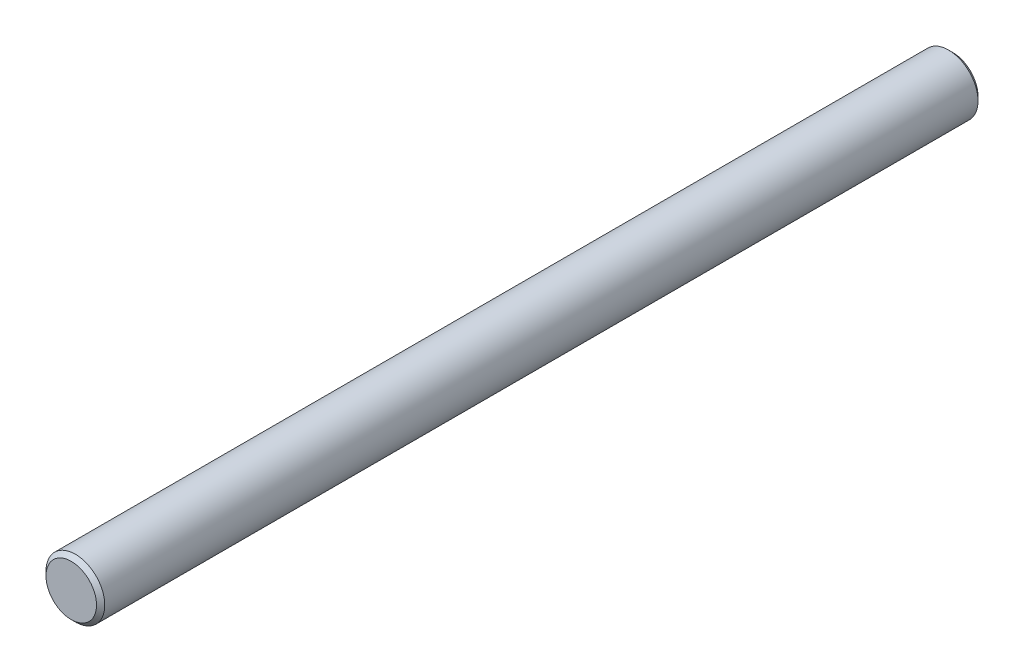
ISO-10303-21;
HEADER;
FILE_DESCRIPTION(('STEP AP214'),'2;1');
FILE_NAME('part.step','',(''),(''),'','','');
FILE_SCHEMA(('AUTOMOTIVE_DESIGN { 1 0 10303 214 1 1 1 1 }'));
ENDSEC;
DATA;
#1=APPLICATION_CONTEXT('core data for automotive mechanical design processes');
#2=APPLICATION_PROTOCOL_DEFINITION('international standard','automotive_design',2000,#1);
#3=PRODUCT_CONTEXT('',#1,'mechanical');
#4=PRODUCT('Part','Part','',(#3));
#5=PRODUCT_RELATED_PRODUCT_CATEGORY('part','',(#4));
#6=PRODUCT_DEFINITION_FORMATION('','',#4);
#7=PRODUCT_DEFINITION_CONTEXT('part definition',#1,'design');
#8=PRODUCT_DEFINITION('design','',#6,#7);
#9=PRODUCT_DEFINITION_SHAPE('','',#8);
#10=(LENGTH_UNIT() NAMED_UNIT(*) SI_UNIT(.MILLI.,.METRE.));
#11=(NAMED_UNIT(*) PLANE_ANGLE_UNIT() SI_UNIT($,.RADIAN.));
#12=(NAMED_UNIT(*) SI_UNIT($,.STERADIAN.) SOLID_ANGLE_UNIT());
#13=UNCERTAINTY_MEASURE_WITH_UNIT(LENGTH_MEASURE(1.E-05),#10,'distance_accuracy_value','');
#14=(GEOMETRIC_REPRESENTATION_CONTEXT(3) GLOBAL_UNCERTAINTY_ASSIGNED_CONTEXT((#13)) GLOBAL_UNIT_ASSIGNED_CONTEXT((#10,
#11,#12)) REPRESENTATION_CONTEXT('',''));
#15=CARTESIAN_POINT('',(0.,0.,0.));
#16=DIRECTION('',(0.,0.,1.));
#17=DIRECTION('',(1.,0.,0.));
#18=AXIS2_PLACEMENT_3D('',#15,#16,#17);
#19=CARTESIAN_POINT('',(0.,0.,60.));
#20=DIRECTION('',(0.,0.,-1.));
#21=DIRECTION('',(-1.,0.,0.));
#22=AXIS2_PLACEMENT_3D('',#19,#20,#21);
#23=CYLINDRICAL_SURFACE('',#22,4.);
#24=CARTESIAN_POINT('',(0.,0.,-59.44));
#25=DIRECTION('',(0.,0.,1.));
#26=DIRECTION('',(1.,0.,0.));
#27=AXIS2_PLACEMENT_3D('',#24,#25,#26);
#28=CIRCLE('',#27,4.);
#29=CARTESIAN_POINT('',(-4.,0.,-59.44));
#30=VERTEX_POINT('',#29);
#31=EDGE_CURVE('E48',#30,#30,#28,.T.);
#32=CARTESIAN_POINT('',(0.,0.,59.44));
#33=DIRECTION('',(0.,0.,1.));
#34=DIRECTION('',(1.,0.,0.));
#35=AXIS2_PLACEMENT_3D('',#32,#33,#34);
#36=CIRCLE('',#35,4.);
#37=CARTESIAN_POINT('',(-4.,0.,59.44));
#38=VERTEX_POINT('',#37);
#39=EDGE_CURVE('E52',#38,#38,#36,.F.);
#40=CARTESIAN_POINT('',(-4.,0.,-59.44));
#41=CARTESIAN_POINT('',(-4.,0.,-58.2016666666667));
#42=CARTESIAN_POINT('',(-4.,0.,-56.9633333333333));
#43=CARTESIAN_POINT('',(-4.,0.,-54.4866666666667));
#44=CARTESIAN_POINT('',(-4.,0.,-53.2483333333333));
#45=CARTESIAN_POINT('',(-4.,0.,-50.7716666666667));
#46=CARTESIAN_POINT('',(-4.,0.,-49.5333333333333));
#47=CARTESIAN_POINT('',(-4.,0.,-47.0566666666667));
#48=CARTESIAN_POINT('',(-4.,0.,-45.8183333333333));
#49=CARTESIAN_POINT('',(-4.,0.,-43.3416666666667));
#50=CARTESIAN_POINT('',(-4.,0.,-42.1033333333333));
#51=CARTESIAN_POINT('',(-4.,0.,-39.6266666666667));
#52=CARTESIAN_POINT('',(-4.,0.,-38.3883333333333));
#53=CARTESIAN_POINT('',(-4.,0.,-35.9116666666667));
#54=CARTESIAN_POINT('',(-4.,0.,-34.6733333333333));
#55=CARTESIAN_POINT('',(-4.,0.,-32.1966666666667));
#56=CARTESIAN_POINT('',(-4.,0.,-30.9583333333333));
#57=CARTESIAN_POINT('',(-4.,0.,-28.4816666666667));
#58=CARTESIAN_POINT('',(-4.,0.,-27.2433333333333));
#59=CARTESIAN_POINT('',(-4.,0.,-24.7666666666667));
#60=CARTESIAN_POINT('',(-4.,0.,-23.5283333333333));
#61=CARTESIAN_POINT('',(-4.,0.,-21.0516666666667));
#62=CARTESIAN_POINT('',(-4.,0.,-19.8133333333333));
#63=CARTESIAN_POINT('',(-4.,0.,-17.3366666666667));
#64=CARTESIAN_POINT('',(-4.,0.,-16.0983333333333));
#65=CARTESIAN_POINT('',(-4.,0.,-13.6216666666667));
#66=CARTESIAN_POINT('',(-4.,0.,-12.3833333333333));
#67=CARTESIAN_POINT('',(-4.,0.,-9.90666666666667));
#68=CARTESIAN_POINT('',(-4.,0.,-8.66833333333333));
#69=CARTESIAN_POINT('',(-4.,0.,-6.19166666666666));
#70=CARTESIAN_POINT('',(-4.,0.,-4.95333333333333));
#71=CARTESIAN_POINT('',(-4.,0.,-2.47666666666666));
#72=CARTESIAN_POINT('',(-4.,0.,-1.23833333333333));
#73=CARTESIAN_POINT('',(-4.,0.,1.23833333333333));
#74=CARTESIAN_POINT('',(-4.,0.,2.47666666666666));
#75=CARTESIAN_POINT('',(-4.,0.,4.95333333333333));
#76=CARTESIAN_POINT('',(-4.,0.,6.19166666666666));
#77=CARTESIAN_POINT('',(-4.,0.,8.66833333333333));
#78=CARTESIAN_POINT('',(-4.,0.,9.90666666666667));
#79=CARTESIAN_POINT('',(-4.,0.,12.3833333333333));
#80=CARTESIAN_POINT('',(-4.,0.,13.6216666666667));
#81=CARTESIAN_POINT('',(-4.,0.,16.0983333333333));
#82=CARTESIAN_POINT('',(-4.,0.,17.3366666666667));
#83=CARTESIAN_POINT('',(-4.,0.,19.8133333333333));
#84=CARTESIAN_POINT('',(-4.,0.,21.0516666666667));
#85=CARTESIAN_POINT('',(-4.,0.,23.5283333333333));
#86=CARTESIAN_POINT('',(-4.,0.,24.7666666666667));
#87=CARTESIAN_POINT('',(-4.,0.,27.2433333333333));
#88=CARTESIAN_POINT('',(-4.,0.,28.4816666666667));
#89=CARTESIAN_POINT('',(-4.,0.,30.9583333333333));
#90=CARTESIAN_POINT('',(-4.,0.,32.1966666666667));
#91=CARTESIAN_POINT('',(-4.,0.,34.6733333333333));
#92=CARTESIAN_POINT('',(-4.,0.,35.9116666666667));
#93=CARTESIAN_POINT('',(-4.,0.,38.3883333333333));
#94=CARTESIAN_POINT('',(-4.,0.,39.6266666666667));
#95=CARTESIAN_POINT('',(-4.,0.,42.1033333333333));
#96=CARTESIAN_POINT('',(-4.,0.,43.3416666666667));
#97=CARTESIAN_POINT('',(-4.,0.,45.8183333333333));
#98=CARTESIAN_POINT('',(-4.,0.,47.0566666666667));
#99=CARTESIAN_POINT('',(-4.,0.,49.5333333333333));
#100=CARTESIAN_POINT('',(-4.,0.,50.7716666666667));
#101=CARTESIAN_POINT('',(-4.,0.,53.2483333333333));
#102=CARTESIAN_POINT('',(-4.,0.,54.4866666666667));
#103=CARTESIAN_POINT('',(-4.,0.,56.9633333333333));
#104=CARTESIAN_POINT('',(-4.,0.,58.2016666666667));
#105=CARTESIAN_POINT('',(-4.,0.,59.44));
#106=B_SPLINE_CURVE_WITH_KNOTS('',3,(#40,#41,#42,#43,#44,#45,#46,#47,#48,#49,#50,#51,#52,#53,
#54,#55,#56,#57,#58,#59,#60,#61,#62,#63,#64,#65,#66,#67,#68,#69,#70,#71,#72,#73,#74,#75,#76,#77,
#78,#79,#80,#81,#82,#83,#84,#85,#86,#87,#88,#89,#90,#91,#92,#93,#94,#95,#96,#97,#98,#99,#100,
#101,#102,#103,#104,#105),.UNSPECIFIED.,.F.,.F.,(4,2,2,2,2,2,2,2,2,2,2,2,2,2,2,2,2,2,2,2,2,2,2,
2,2,2,2,2,2,2,2,2,4),(0.,3.715,7.42999999999999,11.145,14.86,18.575,22.29,26.005,29.72,33.435,
37.15,40.865,44.58,48.295,52.01,55.725,59.44,63.155,66.87,70.585,74.3,78.015,81.73,85.445,89.16,
92.875,96.59,100.305,104.02,107.735,111.45,115.165,118.88),.UNSPECIFIED.);
#107=EDGE_CURVE('BSEAM37',#30,#38,#106,.T.);
#108=ORIENTED_EDGE('',*,*,#31,.T.);
#109=ORIENTED_EDGE('',*,*,#39,.T.);
#110=ORIENTED_EDGE('',*,*,#107,.T.);
#111=ORIENTED_EDGE('',*,*,#107,.F.);
#112=EDGE_LOOP('',(#108,#110,#109,#111));
#113=FACE_BOUND('',#112,.T.);
#114=ADVANCED_FACE('F37',(#113),#23,.T.);
#115=CARTESIAN_POINT('',(0.,0.,60.));
#116=DIRECTION('',(0.,0.,1.));
#117=DIRECTION('',(1.,0.,0.));
#118=AXIS2_PLACEMENT_3D('',#115,#116,#117);
#119=PLANE('',#118);
#120=CARTESIAN_POINT('',(0.,0.,60.));
#121=DIRECTION('',(0.,0.,1.));
#122=DIRECTION('',(1.,0.,0.));
#123=AXIS2_PLACEMENT_3D('',#120,#121,#122);
#124=CIRCLE('',#123,3.44000000000001);
#125=CARTESIAN_POINT('',(-3.44000000000002,0.,60.));
#126=VERTEX_POINT('',#125);
#127=EDGE_CURVE('E10',#126,#126,#124,.T.);
#128=ORIENTED_EDGE('',*,*,#127,.T.);
#129=EDGE_LOOP('',(#128));
#130=FACE_BOUND('',#129,.T.);
#131=ADVANCED_FACE('F68',(#130),#119,.T.);
#132=CARTESIAN_POINT('',(0.,0.,-60.));
#133=DIRECTION('',(0.,0.,1.));
#134=DIRECTION('',(1.,0.,0.));
#135=AXIS2_PLACEMENT_3D('',#132,#133,#134);
#136=PLANE('',#135);
#137=CARTESIAN_POINT('',(0.,0.,-60.));
#138=DIRECTION('',(0.,0.,1.));
#139=DIRECTION('',(1.,0.,0.));
#140=AXIS2_PLACEMENT_3D('',#137,#138,#139);
#141=CIRCLE('',#140,3.44000000000001);
#142=CARTESIAN_POINT('',(3.44000000000001,0.,-60.));
#143=VERTEX_POINT('',#142);
#144=EDGE_CURVE('E44',#143,#143,#141,.F.);
#145=ORIENTED_EDGE('',*,*,#144,.T.);
#146=EDGE_LOOP('',(#145));
#147=FACE_BOUND('',#146,.T.);
#148=ADVANCED_FACE('F65',(#147),#136,.F.);
#149=CARTESIAN_POINT('',(0.,0.,-59.44));
#150=DIRECTION('',(0.,0.,1.));
#151=DIRECTION('',(1.,0.,0.));
#152=AXIS2_PLACEMENT_3D('',#149,#150,#151);
#153=CONICAL_SURFACE('',#152,4.,0.785398163397433);
#154=ORIENTED_EDGE('',*,*,#144,.F.);
#155=EDGE_LOOP('',(#154));
#156=FACE_BOUND('',#155,.T.);
#157=ORIENTED_EDGE('',*,*,#31,.F.);
#158=EDGE_LOOP('',(#157));
#159=FACE_BOUND('',#158,.T.);
#160=ADVANCED_FACE('F61',(#156,#159),#153,.T.);
#161=CARTESIAN_POINT('',(0.,0.,60.));
#162=DIRECTION('',(0.,0.,-1.));
#163=DIRECTION('',(-1.,0.,0.));
#164=AXIS2_PLACEMENT_3D('',#161,#162,#163);
#165=CONICAL_SURFACE('',#164,3.44000000000001,0.785398163397433);
#166=CARTESIAN_POINT('',(-4.,0.,59.44));
#167=CARTESIAN_POINT('',(-3.99416666666667,0.,59.4458333333333));
#168=CARTESIAN_POINT('',(-3.98833333333334,0.,59.4516666666667));
#169=CARTESIAN_POINT('',(-3.97666666666667,0.,59.4633333333333));
#170=CARTESIAN_POINT('',(-3.97083333333334,0.,59.4691666666667));
#171=CARTESIAN_POINT('',(-3.95916666666667,0.,59.4808333333333));
#172=CARTESIAN_POINT('',(-3.95333333333334,0.,59.4866666666667));
#173=CARTESIAN_POINT('',(-3.94166666666667,0.,59.4983333333333));
#174=CARTESIAN_POINT('',(-3.93583333333334,0.,59.5041666666667));
#175=CARTESIAN_POINT('',(-3.92416666666667,0.,59.5158333333333));
#176=CARTESIAN_POINT('',(-3.91833333333334,0.,59.5216666666667));
#177=CARTESIAN_POINT('',(-3.90666666666667,0.,59.5333333333333));
#178=CARTESIAN_POINT('',(-3.90083333333334,0.,59.5391666666667));
#179=CARTESIAN_POINT('',(-3.88916666666667,0.,59.5508333333333));
#180=CARTESIAN_POINT('',(-3.88333333333334,0.,59.5566666666667));
#181=CARTESIAN_POINT('',(-3.87166666666667,0.,59.5683333333333));
#182=CARTESIAN_POINT('',(-3.86583333333334,0.,59.5741666666667));
#183=CARTESIAN_POINT('',(-3.85416666666667,0.,59.5858333333333));
#184=CARTESIAN_POINT('',(-3.84833333333334,0.,59.5916666666667));
#185=CARTESIAN_POINT('',(-3.83666666666667,0.,59.6033333333333));
#186=CARTESIAN_POINT('',(-3.83083333333334,0.,59.6091666666667));
#187=CARTESIAN_POINT('',(-3.81916666666667,0.,59.6208333333333));
#188=CARTESIAN_POINT('',(-3.81333333333334,0.,59.6266666666667));
#189=CARTESIAN_POINT('',(-3.80166666666668,0.,59.6383333333333));
#190=CARTESIAN_POINT('',(-3.79583333333334,0.,59.6441666666667));
#191=CARTESIAN_POINT('',(-3.78416666666667,0.,59.6558333333333));
#192=CARTESIAN_POINT('',(-3.77833333333334,0.,59.6616666666667));
#193=CARTESIAN_POINT('',(-3.76666666666668,0.,59.6733333333333));
#194=CARTESIAN_POINT('',(-3.76083333333334,0.,59.6791666666667));
#195=CARTESIAN_POINT('',(-3.74916666666668,0.,59.6908333333333));
#196=CARTESIAN_POINT('',(-3.74333333333334,0.,59.6966666666667));
#197=CARTESIAN_POINT('',(-3.73166666666668,0.,59.7083333333333));
#198=CARTESIAN_POINT('',(-3.72583333333334,0.,59.7141666666667));
#199=CARTESIAN_POINT('',(-3.71416666666668,0.,59.7258333333333));
#200=CARTESIAN_POINT('',(-3.70833333333334,0.,59.7316666666667));
#201=CARTESIAN_POINT('',(-3.69666666666668,0.,59.7433333333333));
#202=CARTESIAN_POINT('',(-3.69083333333334,0.,59.7491666666667));
#203=CARTESIAN_POINT('',(-3.67916666666668,0.,59.7608333333333));
#204=CARTESIAN_POINT('',(-3.67333333333334,0.,59.7666666666667));
#205=CARTESIAN_POINT('',(-3.66166666666668,0.,59.7783333333333));
#206=CARTESIAN_POINT('',(-3.65583333333334,0.,59.7841666666667));
#207=CARTESIAN_POINT('',(-3.64416666666668,0.,59.7958333333333));
#208=CARTESIAN_POINT('',(-3.63833333333335,0.,59.8016666666667));
#209=CARTESIAN_POINT('',(-3.62666666666668,0.,59.8133333333333));
#210=CARTESIAN_POINT('',(-3.62083333333334,0.,59.8191666666667));
#211=CARTESIAN_POINT('',(-3.60916666666668,0.,59.8308333333333));
#212=CARTESIAN_POINT('',(-3.60333333333335,0.,59.8366666666667));
#213=CARTESIAN_POINT('',(-3.59166666666668,0.,59.8483333333333));
#214=CARTESIAN_POINT('',(-3.58583333333335,0.,59.8541666666667));
#215=CARTESIAN_POINT('',(-3.57416666666668,0.,59.8658333333333));
#216=CARTESIAN_POINT('',(-3.56833333333335,0.,59.8716666666667));
#217=CARTESIAN_POINT('',(-3.55666666666668,0.,59.8833333333333));
#218=CARTESIAN_POINT('',(-3.55083333333335,0.,59.8891666666667));
#219=CARTESIAN_POINT('',(-3.53916666666668,0.,59.9008333333333));
#220=CARTESIAN_POINT('',(-3.53333333333335,0.,59.9066666666667));
#221=CARTESIAN_POINT('',(-3.52166666666668,0.,59.9183333333333));
#222=CARTESIAN_POINT('',(-3.51583333333335,0.,59.9241666666667));
#223=CARTESIAN_POINT('',(-3.50416666666668,0.,59.9358333333333));
#224=CARTESIAN_POINT('',(-3.49833333333335,0.,59.9416666666667));
#225=CARTESIAN_POINT('',(-3.48666666666668,0.,59.9533333333333));
#226=CARTESIAN_POINT('',(-3.48083333333335,0.,59.9591666666667));
#227=CARTESIAN_POINT('',(-3.46916666666668,0.,59.9708333333333));
#228=CARTESIAN_POINT('',(-3.46333333333335,0.,59.9766666666667));
#229=CARTESIAN_POINT('',(-3.45166666666668,0.,59.9883333333333));
#230=CARTESIAN_POINT('',(-3.44583333333335,0.,59.9941666666667));
#231=CARTESIAN_POINT('',(-3.44000000000002,0.,60.));
#232=B_SPLINE_CURVE_WITH_KNOTS('',3,(#166,#167,#168,#169,#170,#171,#172,#173,#174,#175,#176,
#177,#178,#179,#180,#181,#182,#183,#184,#185,#186,#187,#188,#189,#190,#191,#192,#193,#194,#195,
#196,#197,#198,#199,#200,#201,#202,#203,#204,#205,#206,#207,#208,#209,#210,#211,#212,#213,#214,
#215,#216,#217,#218,#219,#220,#221,#222,#223,#224,#225,#226,#227,#228,#229,#230,#231),
.UNSPECIFIED.,.F.,.F.,(4,2,2,2,2,2,2,2,2,2,2,2,2,2,2,2,2,2,2,2,2,2,2,2,2,2,2,2,2,2,2,2,4),(0.,
0.0247487373415312,0.0494974746830575,0.0742462120245894,0.0989949493661157,0.123743686707648,
0.148492424049174,0.173241161390705,0.197989898732232,0.222738636073763,0.24748737341529,
0.272236110756821,0.296984848098348,0.32173358543988,0.346482322781406,0.371231060122937,
0.395979797464464,0.420728534805995,0.445477272147522,0.470226009489053,0.49497474683058,
0.519723484172112,0.544472221513638,0.569220958855169,0.593969696196696,0.618718433538228,
0.643467170879754,0.668215908221285,0.692964645562817,0.717713382904343,0.742462120245875,
0.767210857587401,0.791959594928933),.UNSPECIFIED.);
#233=EDGE_CURVE('BSEAM39',#38,#126,#232,.T.);
#234=ORIENTED_EDGE('',*,*,#39,.F.);
#235=ORIENTED_EDGE('',*,*,#127,.F.);
#236=ORIENTED_EDGE('',*,*,#233,.T.);
#237=ORIENTED_EDGE('',*,*,#233,.F.);
#238=EDGE_LOOP('',(#234,#236,#235,#237));
#239=FACE_BOUND('',#238,.T.);
#240=ADVANCED_FACE('F39',(#239),#165,.T.);
#241=CLOSED_SHELL('',(#114,#131,#148,#160,#240));
#242=MANIFOLD_SOLID_BREP('B2',#241);
#243=ADVANCED_BREP_SHAPE_REPRESENTATION('',(#18,#242),#14);
#244=SHAPE_DEFINITION_REPRESENTATION(#9,#243);
ENDSEC;
END-ISO-10303-21;
